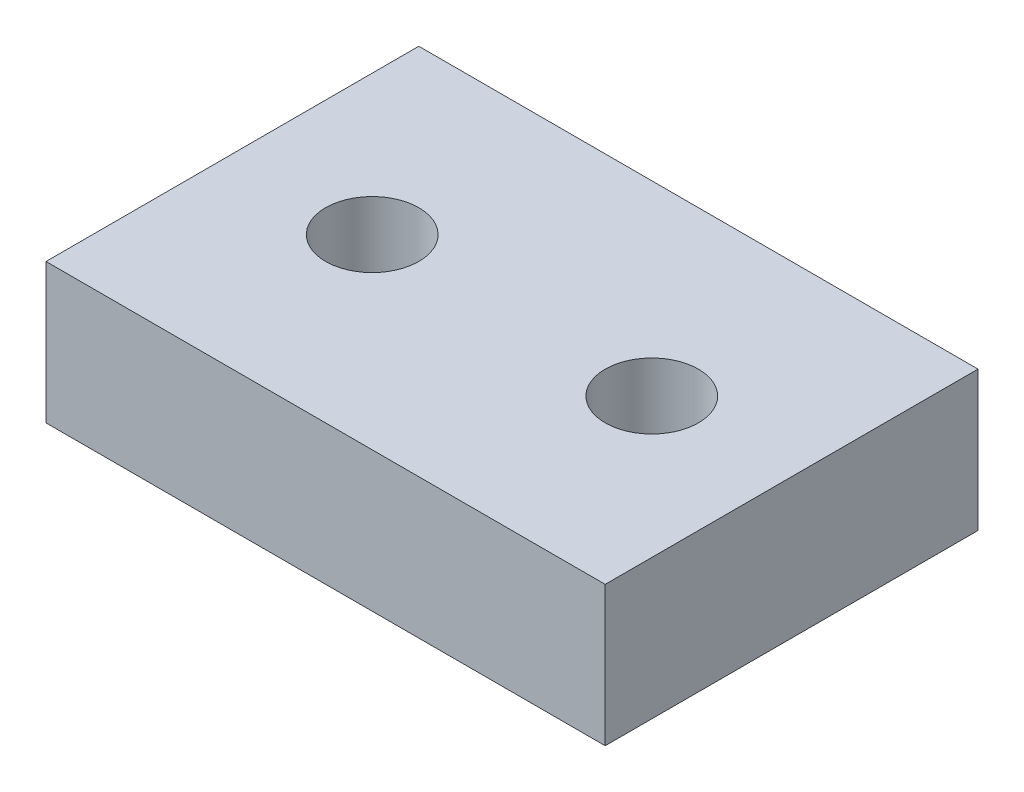
ISO-10303-21;
HEADER;
FILE_DESCRIPTION(('STEP AP214'),'2;1');
FILE_NAME('part.step','',(''),(''),'','','');
FILE_SCHEMA(('AUTOMOTIVE_DESIGN { 1 0 10303 214 1 1 1 1 }'));
ENDSEC;
DATA;
#1=APPLICATION_CONTEXT('core data for automotive mechanical design processes');
#2=APPLICATION_PROTOCOL_DEFINITION('international standard','automotive_design',2000,#1);
#3=PRODUCT_CONTEXT('',#1,'mechanical');
#4=PRODUCT('Part','Part','',(#3));
#5=PRODUCT_RELATED_PRODUCT_CATEGORY('part','',(#4));
#6=PRODUCT_DEFINITION_FORMATION('','',#4);
#7=PRODUCT_DEFINITION_CONTEXT('part definition',#1,'design');
#8=PRODUCT_DEFINITION('design','',#6,#7);
#9=PRODUCT_DEFINITION_SHAPE('','',#8);
#10=(LENGTH_UNIT() NAMED_UNIT(*) SI_UNIT(.MILLI.,.METRE.));
#11=(NAMED_UNIT(*) PLANE_ANGLE_UNIT() SI_UNIT($,.RADIAN.));
#12=(NAMED_UNIT(*) SI_UNIT($,.STERADIAN.) SOLID_ANGLE_UNIT());
#13=UNCERTAINTY_MEASURE_WITH_UNIT(LENGTH_MEASURE(1.E-05),#10,'distance_accuracy_value','');
#14=(GEOMETRIC_REPRESENTATION_CONTEXT(3) GLOBAL_UNCERTAINTY_ASSIGNED_CONTEXT((#13)) GLOBAL_UNIT_ASSIGNED_CONTEXT((#10,
#11,#12)) REPRESENTATION_CONTEXT('',''));
#15=CARTESIAN_POINT('',(0.,0.,0.));
#16=DIRECTION('',(0.,0.,1.));
#17=DIRECTION('',(1.,0.,0.));
#18=AXIS2_PLACEMENT_3D('',#15,#16,#17);
#19=CARTESIAN_POINT('',(0.,0.,50.8));
#20=DIRECTION('',(-1.,0.,0.));
#21=DIRECTION('',(0.,0.,1.));
#22=AXIS2_PLACEMENT_3D('',#19,#20,#21);
#23=PLANE('',#22);
#24=DIRECTION('',(0.,1.,0.));
#25=VECTOR('',#24,1.);
#26=CARTESIAN_POINT('',(0.,0.,0.));
#27=LINE('',#26,#25);
#28=CARTESIAN_POINT('',(0.,0.,0.));
#29=VERTEX_POINT('',#28);
#30=CARTESIAN_POINT('',(0.,19.05,0.));
#31=VERTEX_POINT('',#30);
#32=EDGE_CURVE('E96',#29,#31,#27,.T.);
#33=ORIENTED_EDGE('',*,*,#32,.F.);
#34=DIRECTION('',(0.,0.,-1.));
#35=VECTOR('',#34,1.);
#36=CARTESIAN_POINT('',(0.,0.,50.8));
#37=LINE('',#36,#35);
#38=CARTESIAN_POINT('',(0.,0.,50.8));
#39=VERTEX_POINT('',#38);
#40=EDGE_CURVE('E11',#39,#29,#37,.T.);
#41=ORIENTED_EDGE('',*,*,#40,.F.);
#42=DIRECTION('',(0.,1.,0.));
#43=VECTOR('',#42,1.);
#44=CARTESIAN_POINT('',(0.,0.,50.8));
#45=LINE('',#44,#43);
#46=CARTESIAN_POINT('',(0.,19.05,50.8));
#47=VERTEX_POINT('',#46);
#48=EDGE_CURVE('E88',#39,#47,#45,.T.);
#49=ORIENTED_EDGE('',*,*,#48,.T.);
#50=DIRECTION('',(0.,0.,-1.));
#51=VECTOR('',#50,1.);
#52=CARTESIAN_POINT('',(0.,19.05,50.8));
#53=LINE('',#52,#51);
#54=EDGE_CURVE('E35',#47,#31,#53,.T.);
#55=ORIENTED_EDGE('',*,*,#54,.T.);
#56=EDGE_LOOP('',(#33,#41,#49,#55));
#57=FACE_BOUND('',#56,.T.);
#58=ADVANCED_FACE('F32',(#57),#23,.T.);
#59=CARTESIAN_POINT('',(0.,0.,50.8));
#60=DIRECTION('',(0.,1.,0.));
#61=DIRECTION('',(-1.,0.,0.));
#62=AXIS2_PLACEMENT_3D('',#59,#60,#61);
#63=PLANE('',#62);
#64=CARTESIAN_POINT('',(19.05,0.,25.4));
#65=DIRECTION('',(0.,1.,0.));
#66=DIRECTION('',(-1.,0.,0.));
#67=AXIS2_PLACEMENT_3D('',#64,#65,#66);
#68=CIRCLE('',#67,6.35);
#69=CARTESIAN_POINT('',(12.7,0.,25.4));
#70=VERTEX_POINT('',#69);
#71=EDGE_CURVE('E109',#70,#70,#68,.T.);
#72=ORIENTED_EDGE('',*,*,#71,.T.);
#73=EDGE_LOOP('',(#72));
#74=FACE_BOUND('',#73,.T.);
#75=CARTESIAN_POINT('',(57.15,0.,25.4));
#76=DIRECTION('',(0.,1.,0.));
#77=DIRECTION('',(-1.,0.,0.));
#78=AXIS2_PLACEMENT_3D('',#75,#76,#77);
#79=CIRCLE('',#78,6.35);
#80=CARTESIAN_POINT('',(50.8,0.,25.4));
#81=VERTEX_POINT('',#80);
#82=EDGE_CURVE('E100',#81,#81,#79,.T.);
#83=ORIENTED_EDGE('',*,*,#82,.T.);
#84=EDGE_LOOP('',(#83));
#85=FACE_BOUND('',#84,.T.);
#86=DIRECTION('',(1.,0.,0.));
#87=VECTOR('',#86,1.);
#88=CARTESIAN_POINT('',(0.,0.,0.));
#89=LINE('',#88,#87);
#90=CARTESIAN_POINT('',(76.2,0.,0.));
#91=VERTEX_POINT('',#90);
#92=EDGE_CURVE('E103',#29,#91,#89,.T.);
#93=ORIENTED_EDGE('',*,*,#92,.T.);
#94=DIRECTION('',(0.,0.,-1.));
#95=VECTOR('',#94,1.);
#96=CARTESIAN_POINT('',(76.2,0.,50.8));
#97=LINE('',#96,#95);
#98=CARTESIAN_POINT('',(76.2,0.,50.8));
#99=VERTEX_POINT('',#98);
#100=EDGE_CURVE('E41',#99,#91,#97,.T.);
#101=ORIENTED_EDGE('',*,*,#100,.F.);
#102=DIRECTION('',(1.,0.,0.));
#103=VECTOR('',#102,1.);
#104=CARTESIAN_POINT('',(0.,0.,50.8));
#105=LINE('',#104,#103);
#106=EDGE_CURVE('E91',#39,#99,#105,.T.);
#107=ORIENTED_EDGE('',*,*,#106,.F.);
#108=ORIENTED_EDGE('',*,*,#40,.T.);
#109=EDGE_LOOP('',(#93,#101,#107,#108));
#110=FACE_BOUND('',#109,.T.);
#111=ADVANCED_FACE('F118',(#74,#85,#110),#63,.F.);
#112=CARTESIAN_POINT('',(76.2,19.05,50.8));
#113=DIRECTION('',(1.,0.,0.));
#114=DIRECTION('',(0.,0.,-1.));
#115=AXIS2_PLACEMENT_3D('',#112,#113,#114);
#116=PLANE('',#115);
#117=DIRECTION('',(0.,-1.,0.));
#118=VECTOR('',#117,1.);
#119=CARTESIAN_POINT('',(76.2,19.05,0.));
#120=LINE('',#119,#118);
#121=CARTESIAN_POINT('',(76.2,19.05,0.));
#122=VERTEX_POINT('',#121);
#123=EDGE_CURVE('E83',#122,#91,#120,.T.);
#124=ORIENTED_EDGE('',*,*,#123,.F.);
#125=DIRECTION('',(0.,0.,-1.));
#126=VECTOR('',#125,1.);
#127=CARTESIAN_POINT('',(76.2,19.05,50.8));
#128=LINE('',#127,#126);
#129=CARTESIAN_POINT('',(76.2,19.05,50.8));
#130=VERTEX_POINT('',#129);
#131=EDGE_CURVE('E79',#130,#122,#128,.T.);
#132=ORIENTED_EDGE('',*,*,#131,.F.);
#133=DIRECTION('',(0.,-1.,0.));
#134=VECTOR('',#133,1.);
#135=CARTESIAN_POINT('',(76.2,19.05,50.8));
#136=LINE('',#135,#134);
#137=EDGE_CURVE('E81',#130,#99,#136,.T.);
#138=ORIENTED_EDGE('',*,*,#137,.T.);
#139=ORIENTED_EDGE('',*,*,#100,.T.);
#140=EDGE_LOOP('',(#124,#132,#138,#139));
#141=FACE_BOUND('',#140,.T.);
#142=ADVANCED_FACE('F80',(#141),#116,.T.);
#143=CARTESIAN_POINT('',(76.2,19.05,50.8));
#144=DIRECTION('',(0.,-1.,0.));
#145=DIRECTION('',(1.,0.,0.));
#146=AXIS2_PLACEMENT_3D('',#143,#144,#145);
#147=PLANE('',#146);
#148=CARTESIAN_POINT('',(19.05,19.05,25.4));
#149=DIRECTION('',(0.,1.,0.));
#150=DIRECTION('',(-1.,0.,0.));
#151=AXIS2_PLACEMENT_3D('',#148,#149,#150);
#152=CIRCLE('',#151,6.35);
#153=CARTESIAN_POINT('',(12.7,19.05,25.4));
#154=VERTEX_POINT('',#153);
#155=EDGE_CURVE('E112',#154,#154,#152,.T.);
#156=ORIENTED_EDGE('',*,*,#155,.F.);
#157=EDGE_LOOP('',(#156));
#158=FACE_BOUND('',#157,.T.);
#159=CARTESIAN_POINT('',(57.15,19.05,25.4));
#160=DIRECTION('',(0.,1.,0.));
#161=DIRECTION('',(-1.,0.,0.));
#162=AXIS2_PLACEMENT_3D('',#159,#160,#161);
#163=CIRCLE('',#162,6.35);
#164=CARTESIAN_POINT('',(50.8,19.05,25.4));
#165=VERTEX_POINT('',#164);
#166=EDGE_CURVE('E106',#165,#165,#163,.T.);
#167=ORIENTED_EDGE('',*,*,#166,.F.);
#168=EDGE_LOOP('',(#167));
#169=FACE_BOUND('',#168,.T.);
#170=DIRECTION('',(-1.,0.,0.));
#171=VECTOR('',#170,1.);
#172=CARTESIAN_POINT('',(76.2,19.05,0.));
#173=LINE('',#172,#171);
#174=EDGE_CURVE('E99',#122,#31,#173,.T.);
#175=ORIENTED_EDGE('',*,*,#174,.T.);
#176=ORIENTED_EDGE('',*,*,#54,.F.);
#177=DIRECTION('',(-1.,0.,0.));
#178=VECTOR('',#177,1.);
#179=CARTESIAN_POINT('',(76.2,19.05,50.8));
#180=LINE('',#179,#178);
#181=EDGE_CURVE('E76',#130,#47,#180,.T.);
#182=ORIENTED_EDGE('',*,*,#181,.F.);
#183=ORIENTED_EDGE('',*,*,#131,.T.);
#184=EDGE_LOOP('',(#175,#176,#182,#183));
#185=FACE_BOUND('',#184,.T.);
#186=ADVANCED_FACE('F87',(#158,#169,#185),#147,.F.);
#187=CARTESIAN_POINT('',(0.,0.,50.8));
#188=DIRECTION('',(0.,0.,-1.));
#189=DIRECTION('',(-1.,0.,0.));
#190=AXIS2_PLACEMENT_3D('',#187,#188,#189);
#191=PLANE('',#190);
#192=ORIENTED_EDGE('',*,*,#48,.F.);
#193=ORIENTED_EDGE('',*,*,#106,.T.);
#194=ORIENTED_EDGE('',*,*,#137,.F.);
#195=ORIENTED_EDGE('',*,*,#181,.T.);
#196=EDGE_LOOP('',(#192,#193,#194,#195));
#197=FACE_BOUND('',#196,.T.);
#198=ADVANCED_FACE('F90',(#197),#191,.F.);
#199=CARTESIAN_POINT('',(0.,0.,0.));
#200=DIRECTION('',(0.,0.,-1.));
#201=DIRECTION('',(-1.,0.,0.));
#202=AXIS2_PLACEMENT_3D('',#199,#200,#201);
#203=PLANE('',#202);
#204=ORIENTED_EDGE('',*,*,#32,.T.);
#205=ORIENTED_EDGE('',*,*,#174,.F.);
#206=ORIENTED_EDGE('',*,*,#123,.T.);
#207=ORIENTED_EDGE('',*,*,#92,.F.);
#208=EDGE_LOOP('',(#204,#205,#206,#207));
#209=FACE_BOUND('',#208,.T.);
#210=ADVANCED_FACE('F133',(#209),#203,.T.);
#211=CARTESIAN_POINT('',(57.15,0.,25.4));
#212=DIRECTION('',(0.,1.,0.));
#213=DIRECTION('',(-1.,0.,0.));
#214=AXIS2_PLACEMENT_3D('',#211,#212,#213);
#215=CYLINDRICAL_SURFACE('',#214,6.35);
#216=ORIENTED_EDGE('',*,*,#82,.F.);
#217=EDGE_LOOP('',(#216));
#218=FACE_BOUND('',#217,.T.);
#219=ORIENTED_EDGE('',*,*,#166,.T.);
#220=EDGE_LOOP('',(#219));
#221=FACE_BOUND('',#220,.T.);
#222=ADVANCED_FACE('F124',(#218,#221),#215,.F.);
#223=CARTESIAN_POINT('',(19.05,0.,25.4));
#224=DIRECTION('',(0.,1.,0.));
#225=DIRECTION('',(-1.,0.,0.));
#226=AXIS2_PLACEMENT_3D('',#223,#224,#225);
#227=CYLINDRICAL_SURFACE('',#226,6.35);
#228=ORIENTED_EDGE('',*,*,#71,.F.);
#229=EDGE_LOOP('',(#228));
#230=FACE_BOUND('',#229,.T.);
#231=ORIENTED_EDGE('',*,*,#155,.T.);
#232=EDGE_LOOP('',(#231));
#233=FACE_BOUND('',#232,.T.);
#234=ADVANCED_FACE('F121',(#230,#233),#227,.F.);
#235=CLOSED_SHELL('',(#58,#111,#142,#186,#198,#210,#222,#234));
#236=MANIFOLD_SOLID_BREP('B2',#235);
#237=ADVANCED_BREP_SHAPE_REPRESENTATION('',(#18,#236),#14);
#238=SHAPE_DEFINITION_REPRESENTATION(#9,#237);
ENDSEC;
END-ISO-10303-21;
